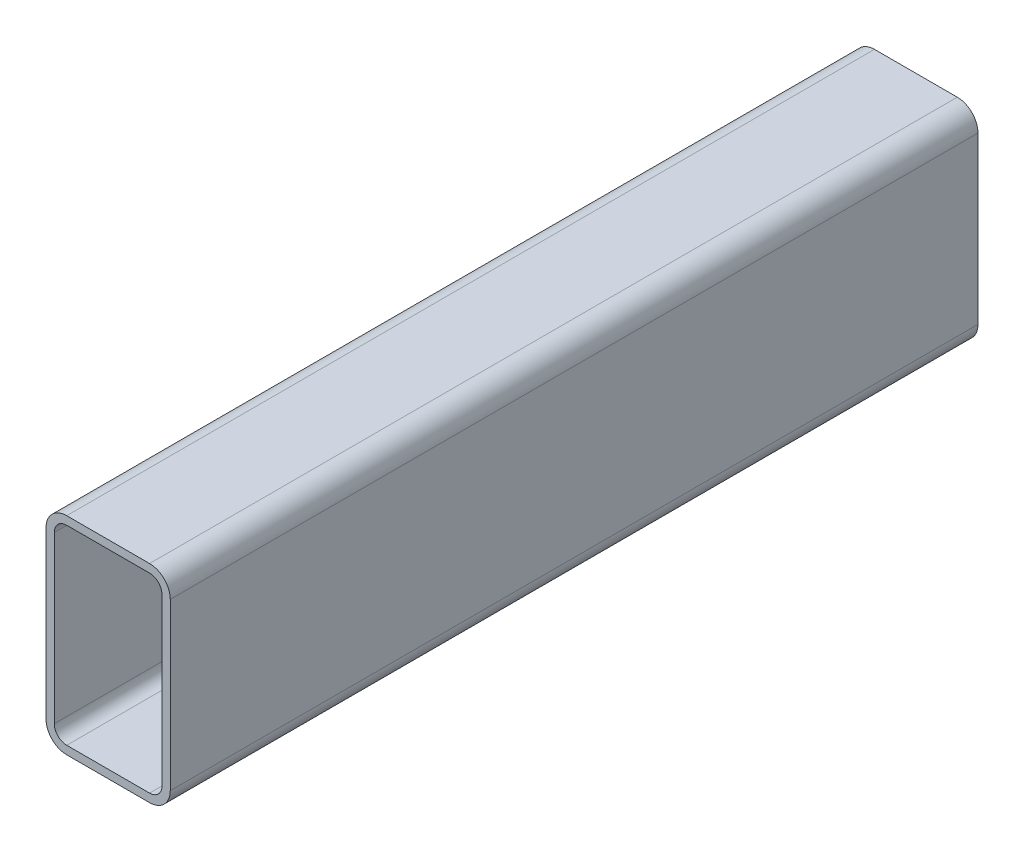
ISO-10303-21;
HEADER;
FILE_DESCRIPTION(('STEP AP214'),'2;1');
FILE_NAME('part.step','',(''),(''),'','','');
FILE_SCHEMA(('AUTOMOTIVE_DESIGN { 1 0 10303 214 1 1 1 1 }'));
ENDSEC;
DATA;
#1=APPLICATION_CONTEXT('core data for automotive mechanical design processes');
#2=APPLICATION_PROTOCOL_DEFINITION('international standard','automotive_design',2000,#1);
#3=PRODUCT_CONTEXT('',#1,'mechanical');
#4=PRODUCT('Part','Part','',(#3));
#5=PRODUCT_RELATED_PRODUCT_CATEGORY('part','',(#4));
#6=PRODUCT_DEFINITION_FORMATION('','',#4);
#7=PRODUCT_DEFINITION_CONTEXT('part definition',#1,'design');
#8=PRODUCT_DEFINITION('design','',#6,#7);
#9=PRODUCT_DEFINITION_SHAPE('','',#8);
#10=(LENGTH_UNIT() NAMED_UNIT(*) SI_UNIT(.MILLI.,.METRE.));
#11=(NAMED_UNIT(*) PLANE_ANGLE_UNIT() SI_UNIT($,.RADIAN.));
#12=(NAMED_UNIT(*) SI_UNIT($,.STERADIAN.) SOLID_ANGLE_UNIT());
#13=UNCERTAINTY_MEASURE_WITH_UNIT(LENGTH_MEASURE(1.E-05),#10,'distance_accuracy_value','');
#14=(GEOMETRIC_REPRESENTATION_CONTEXT(3) GLOBAL_UNCERTAINTY_ASSIGNED_CONTEXT((#13)) GLOBAL_UNIT_ASSIGNED_CONTEXT((#10,
#11,#12)) REPRESENTATION_CONTEXT('',''));
#15=CARTESIAN_POINT('',(0.,0.,0.));
#16=DIRECTION('',(0.,0.,1.));
#17=DIRECTION('',(1.,0.,0.));
#18=AXIS2_PLACEMENT_3D('',#15,#16,#17);
#19=CARTESIAN_POINT('',(-25.,50.,243.75));
#20=DIRECTION('',(0.,0.,-1.));
#21=DIRECTION('',(-1.,0.,0.));
#22=AXIS2_PLACEMENT_3D('',#19,#20,#21);
#23=PLANE('',#22);
#24=DIRECTION('',(0.,-1.,0.));
#25=VECTOR('',#24,1.);
#26=CARTESIAN_POINT('',(-37.5,0.,243.75));
#27=LINE('',#26,#25);
#28=CARTESIAN_POINT('',(-37.5,49.9999999999999,243.75));
#29=VERTEX_POINT('',#28);
#30=CARTESIAN_POINT('',(-37.5,-49.9999999999999,243.75));
#31=VERTEX_POINT('',#30);
#32=EDGE_CURVE('E212',#29,#31,#27,.T.);
#33=ORIENTED_EDGE('',*,*,#32,.T.);
#34=CARTESIAN_POINT('',(-25.,-50.,243.75));
#35=DIRECTION('',(0.,0.,1.));
#36=DIRECTION('',(1.,0.,0.));
#37=AXIS2_PLACEMENT_3D('',#34,#35,#36);
#38=CIRCLE('',#37,12.5);
#39=CARTESIAN_POINT('',(-24.9999999999999,-62.5,243.75));
#40=VERTEX_POINT('',#39);
#41=EDGE_CURVE('E214',#31,#40,#38,.T.);
#42=ORIENTED_EDGE('',*,*,#41,.T.);
#43=DIRECTION('',(1.,0.,0.));
#44=VECTOR('',#43,1.);
#45=CARTESIAN_POINT('',(-24.9999999999999,-62.5,243.75));
#46=LINE('',#45,#44);
#47=CARTESIAN_POINT('',(24.9999999999999,-62.5,243.75));
#48=VERTEX_POINT('',#47);
#49=EDGE_CURVE('E217',#40,#48,#46,.T.);
#50=ORIENTED_EDGE('',*,*,#49,.T.);
#51=CARTESIAN_POINT('',(25.,-50.,243.75));
#52=DIRECTION('',(0.,0.,1.));
#53=DIRECTION('',(-1.,0.,0.));
#54=AXIS2_PLACEMENT_3D('',#51,#52,#53);
#55=CIRCLE('',#54,12.5);
#56=CARTESIAN_POINT('',(37.5,-49.9999999999999,243.75));
#57=VERTEX_POINT('',#56);
#58=EDGE_CURVE('E219',#48,#57,#55,.T.);
#59=ORIENTED_EDGE('',*,*,#58,.T.);
#60=DIRECTION('',(0.,1.,0.));
#61=VECTOR('',#60,1.);
#62=CARTESIAN_POINT('',(37.5,0.,243.75));
#63=LINE('',#62,#61);
#64=CARTESIAN_POINT('',(37.5,49.9999999999999,243.75));
#65=VERTEX_POINT('',#64);
#66=EDGE_CURVE('E221',#57,#65,#63,.T.);
#67=ORIENTED_EDGE('',*,*,#66,.T.);
#68=CARTESIAN_POINT('',(25.,50.,243.75));
#69=DIRECTION('',(0.,0.,1.));
#70=DIRECTION('',(1.,0.,0.));
#71=AXIS2_PLACEMENT_3D('',#68,#69,#70);
#72=CIRCLE('',#71,12.5);
#73=CARTESIAN_POINT('',(24.9999999999999,62.5,243.75));
#74=VERTEX_POINT('',#73);
#75=EDGE_CURVE('E223',#65,#74,#72,.T.);
#76=ORIENTED_EDGE('',*,*,#75,.T.);
#77=DIRECTION('',(-1.,0.,0.));
#78=VECTOR('',#77,1.);
#79=CARTESIAN_POINT('',(-24.9999999999999,62.5,243.75));
#80=LINE('',#79,#78);
#81=CARTESIAN_POINT('',(-24.9999999999999,62.5,243.75));
#82=VERTEX_POINT('',#81);
#83=EDGE_CURVE('E225',#74,#82,#80,.T.);
#84=ORIENTED_EDGE('',*,*,#83,.T.);
#85=CARTESIAN_POINT('',(-25.,50.,243.75));
#86=DIRECTION('',(0.,0.,1.));
#87=DIRECTION('',(-1.,0.,0.));
#88=AXIS2_PLACEMENT_3D('',#85,#86,#87);
#89=CIRCLE('',#88,12.5);
#90=EDGE_CURVE('E227',#82,#29,#89,.T.);
#91=ORIENTED_EDGE('',*,*,#90,.T.);
#92=EDGE_LOOP('',(#33,#42,#50,#59,#67,#76,#84,#91));
#93=FACE_BOUND('',#92,.T.);
#94=CARTESIAN_POINT('',(25.,50.,243.75));
#95=DIRECTION('',(0.,0.,1.));
#96=DIRECTION('',(1.,0.,0.));
#97=AXIS2_PLACEMENT_3D('',#94,#95,#96);
#98=CIRCLE('',#97,7.49999999999999);
#99=CARTESIAN_POINT('',(32.5,49.9999999999999,243.75));
#100=VERTEX_POINT('',#99);
#101=CARTESIAN_POINT('',(25.,57.5,243.75));
#102=VERTEX_POINT('',#101);
#103=EDGE_CURVE('E150',#100,#102,#98,.T.);
#104=ORIENTED_EDGE('',*,*,#103,.F.);
#105=DIRECTION('',(0.,1.,0.));
#106=VECTOR('',#105,1.);
#107=CARTESIAN_POINT('',(32.5,0.,243.75));
#108=LINE('',#107,#106);
#109=CARTESIAN_POINT('',(32.5,-49.9999999999999,243.75));
#110=VERTEX_POINT('',#109);
#111=EDGE_CURVE('E145',#110,#100,#108,.T.);
#112=ORIENTED_EDGE('',*,*,#111,.F.);
#113=CARTESIAN_POINT('',(25.,-50.,243.75));
#114=DIRECTION('',(0.,0.,1.));
#115=DIRECTION('',(-1.,0.,0.));
#116=AXIS2_PLACEMENT_3D('',#113,#114,#115);
#117=CIRCLE('',#116,7.49999999999999);
#118=CARTESIAN_POINT('',(25.,-57.5,243.75));
#119=VERTEX_POINT('',#118);
#120=EDGE_CURVE('E176',#119,#110,#117,.T.);
#121=ORIENTED_EDGE('',*,*,#120,.F.);
#122=DIRECTION('',(1.,0.,0.));
#123=VECTOR('',#122,1.);
#124=CARTESIAN_POINT('',(-25.,-57.5,243.75));
#125=LINE('',#124,#123);
#126=CARTESIAN_POINT('',(-25.,-57.5,243.75));
#127=VERTEX_POINT('',#126);
#128=EDGE_CURVE('E174',#127,#119,#125,.T.);
#129=ORIENTED_EDGE('',*,*,#128,.F.);
#130=CARTESIAN_POINT('',(-25.,-50.,243.75));
#131=DIRECTION('',(0.,0.,1.));
#132=DIRECTION('',(1.,0.,0.));
#133=AXIS2_PLACEMENT_3D('',#130,#131,#132);
#134=CIRCLE('',#133,7.49999999999999);
#135=CARTESIAN_POINT('',(-32.5,-49.9999999999999,243.75));
#136=VERTEX_POINT('',#135);
#137=EDGE_CURVE('E172',#136,#127,#134,.T.);
#138=ORIENTED_EDGE('',*,*,#137,.F.);
#139=DIRECTION('',(0.,-1.,0.));
#140=VECTOR('',#139,1.);
#141=CARTESIAN_POINT('',(-32.5,0.,243.75));
#142=LINE('',#141,#140);
#143=CARTESIAN_POINT('',(-32.5,49.9999999999999,243.75));
#144=VERTEX_POINT('',#143);
#145=EDGE_CURVE('E170',#144,#136,#142,.T.);
#146=ORIENTED_EDGE('',*,*,#145,.F.);
#147=CARTESIAN_POINT('',(-25.,50.,243.75));
#148=DIRECTION('',(0.,0.,1.));
#149=DIRECTION('',(-1.,0.,0.));
#150=AXIS2_PLACEMENT_3D('',#147,#148,#149);
#151=CIRCLE('',#150,7.49999999999999);
#152=CARTESIAN_POINT('',(-25.,57.5,243.75));
#153=VERTEX_POINT('',#152);
#154=EDGE_CURVE('E166',#153,#144,#151,.T.);
#155=ORIENTED_EDGE('',*,*,#154,.F.);
#156=DIRECTION('',(-1.,0.,0.));
#157=VECTOR('',#156,1.);
#158=CARTESIAN_POINT('',(-25.,57.5,243.75));
#159=LINE('',#158,#157);
#160=EDGE_CURVE('E164',#102,#153,#159,.T.);
#161=ORIENTED_EDGE('',*,*,#160,.F.);
#162=EDGE_LOOP('',(#104,#112,#121,#129,#138,#146,#155,#161));
#163=FACE_BOUND('',#162,.T.);
#164=ADVANCED_FACE('F35',(#93,#163),#23,.F.);
#165=CARTESIAN_POINT('',(-25.,50.,-243.75));
#166=DIRECTION('',(0.,0.,-1.));
#167=DIRECTION('',(-1.,0.,0.));
#168=AXIS2_PLACEMENT_3D('',#165,#166,#167);
#169=PLANE('',#168);
#170=DIRECTION('',(0.,-1.,0.));
#171=VECTOR('',#170,1.);
#172=CARTESIAN_POINT('',(-37.5,0.,-243.75));
#173=LINE('',#172,#171);
#174=CARTESIAN_POINT('',(-37.5,49.9999999999999,-243.75));
#175=VERTEX_POINT('',#174);
#176=CARTESIAN_POINT('',(-37.5,-49.9999999999999,-243.75));
#177=VERTEX_POINT('',#176);
#178=EDGE_CURVE('E159',#175,#177,#173,.T.);
#179=ORIENTED_EDGE('',*,*,#178,.F.);
#180=CARTESIAN_POINT('',(-25.,50.,-243.75));
#181=DIRECTION('',(0.,0.,1.));
#182=DIRECTION('',(-1.,0.,0.));
#183=AXIS2_PLACEMENT_3D('',#180,#181,#182);
#184=CIRCLE('',#183,12.5);
#185=CARTESIAN_POINT('',(-24.9999999999999,62.5,-243.75));
#186=VERTEX_POINT('',#185);
#187=EDGE_CURVE('E215',#186,#175,#184,.T.);
#188=ORIENTED_EDGE('',*,*,#187,.F.);
#189=DIRECTION('',(-1.,0.,0.));
#190=VECTOR('',#189,1.);
#191=CARTESIAN_POINT('',(-24.9999999999999,62.5,-243.75));
#192=LINE('',#191,#190);
#193=CARTESIAN_POINT('',(24.9999999999999,62.5,-243.75));
#194=VERTEX_POINT('',#193);
#195=EDGE_CURVE('E243',#194,#186,#192,.T.);
#196=ORIENTED_EDGE('',*,*,#195,.F.);
#197=CARTESIAN_POINT('',(25.,50.,-243.75));
#198=DIRECTION('',(0.,0.,1.));
#199=DIRECTION('',(1.,0.,0.));
#200=AXIS2_PLACEMENT_3D('',#197,#198,#199);
#201=CIRCLE('',#200,12.5);
#202=CARTESIAN_POINT('',(37.5,49.9999999999999,-243.75));
#203=VERTEX_POINT('',#202);
#204=EDGE_CURVE('E241',#203,#194,#201,.T.);
#205=ORIENTED_EDGE('',*,*,#204,.F.);
#206=DIRECTION('',(0.,1.,0.));
#207=VECTOR('',#206,1.);
#208=CARTESIAN_POINT('',(37.5,0.,-243.75));
#209=LINE('',#208,#207);
#210=CARTESIAN_POINT('',(37.5,-49.9999999999999,-243.75));
#211=VERTEX_POINT('',#210);
#212=EDGE_CURVE('E239',#211,#203,#209,.T.);
#213=ORIENTED_EDGE('',*,*,#212,.F.);
#214=CARTESIAN_POINT('',(25.,-50.,-243.75));
#215=DIRECTION('',(0.,0.,1.));
#216=DIRECTION('',(-1.,0.,0.));
#217=AXIS2_PLACEMENT_3D('',#214,#215,#216);
#218=CIRCLE('',#217,12.5);
#219=CARTESIAN_POINT('',(24.9999999999999,-62.5,-243.75));
#220=VERTEX_POINT('',#219);
#221=EDGE_CURVE('E236',#220,#211,#218,.T.);
#222=ORIENTED_EDGE('',*,*,#221,.F.);
#223=DIRECTION('',(1.,0.,0.));
#224=VECTOR('',#223,1.);
#225=CARTESIAN_POINT('',(24.9999999999999,-62.5,-243.75));
#226=LINE('',#225,#224);
#227=CARTESIAN_POINT('',(-24.9999999999999,-62.5,-243.75));
#228=VERTEX_POINT('',#227);
#229=EDGE_CURVE('E234',#228,#220,#226,.T.);
#230=ORIENTED_EDGE('',*,*,#229,.F.);
#231=CARTESIAN_POINT('',(-25.,-50.,-243.75));
#232=DIRECTION('',(0.,0.,1.));
#233=DIRECTION('',(1.,0.,0.));
#234=AXIS2_PLACEMENT_3D('',#231,#232,#233);
#235=CIRCLE('',#234,12.5);
#236=EDGE_CURVE('E231',#177,#228,#235,.T.);
#237=ORIENTED_EDGE('',*,*,#236,.F.);
#238=EDGE_LOOP('',(#179,#188,#196,#205,#213,#222,#230,#237));
#239=FACE_BOUND('',#238,.T.);
#240=DIRECTION('',(0.,1.,0.));
#241=VECTOR('',#240,1.);
#242=CARTESIAN_POINT('',(32.5,0.,-243.75));
#243=LINE('',#242,#241);
#244=CARTESIAN_POINT('',(32.5,-49.9999999999999,-243.75));
#245=VERTEX_POINT('',#244);
#246=CARTESIAN_POINT('',(32.5,49.9999999999999,-243.75));
#247=VERTEX_POINT('',#246);
#248=EDGE_CURVE('E151',#245,#247,#243,.T.);
#249=ORIENTED_EDGE('',*,*,#248,.T.);
#250=CARTESIAN_POINT('',(25.,50.,-243.75));
#251=DIRECTION('',(0.,0.,1.));
#252=DIRECTION('',(1.,0.,0.));
#253=AXIS2_PLACEMENT_3D('',#250,#251,#252);
#254=CIRCLE('',#253,7.49999999999999);
#255=CARTESIAN_POINT('',(25.,57.5,-243.75));
#256=VERTEX_POINT('',#255);
#257=EDGE_CURVE('E157',#247,#256,#254,.T.);
#258=ORIENTED_EDGE('',*,*,#257,.T.);
#259=DIRECTION('',(-1.,0.,0.));
#260=VECTOR('',#259,1.);
#261=CARTESIAN_POINT('',(-25.,57.5,-243.75));
#262=LINE('',#261,#260);
#263=CARTESIAN_POINT('',(-25.,57.5,-243.75));
#264=VERTEX_POINT('',#263);
#265=EDGE_CURVE('E179',#256,#264,#262,.T.);
#266=ORIENTED_EDGE('',*,*,#265,.T.);
#267=CARTESIAN_POINT('',(-25.,50.,-243.75));
#268=DIRECTION('',(0.,0.,1.));
#269=DIRECTION('',(-1.,0.,0.));
#270=AXIS2_PLACEMENT_3D('',#267,#268,#269);
#271=CIRCLE('',#270,7.49999999999999);
#272=CARTESIAN_POINT('',(-32.5,49.9999999999999,-243.75));
#273=VERTEX_POINT('',#272);
#274=EDGE_CURVE('E182',#264,#273,#271,.T.);
#275=ORIENTED_EDGE('',*,*,#274,.T.);
#276=DIRECTION('',(0.,-1.,0.));
#277=VECTOR('',#276,1.);
#278=CARTESIAN_POINT('',(-32.5,0.,-243.75));
#279=LINE('',#278,#277);
#280=CARTESIAN_POINT('',(-32.5,-49.9999999999999,-243.75));
#281=VERTEX_POINT('',#280);
#282=EDGE_CURVE('E185',#273,#281,#279,.T.);
#283=ORIENTED_EDGE('',*,*,#282,.T.);
#284=CARTESIAN_POINT('',(-25.,-50.,-243.75));
#285=DIRECTION('',(0.,0.,1.));
#286=DIRECTION('',(1.,0.,0.));
#287=AXIS2_PLACEMENT_3D('',#284,#285,#286);
#288=CIRCLE('',#287,7.49999999999999);
#289=CARTESIAN_POINT('',(-25.,-57.5,-243.75));
#290=VERTEX_POINT('',#289);
#291=EDGE_CURVE('E188',#281,#290,#288,.T.);
#292=ORIENTED_EDGE('',*,*,#291,.T.);
#293=DIRECTION('',(1.,0.,0.));
#294=VECTOR('',#293,1.);
#295=CARTESIAN_POINT('',(25.,-57.5,-243.75));
#296=LINE('',#295,#294);
#297=CARTESIAN_POINT('',(25.,-57.5,-243.75));
#298=VERTEX_POINT('',#297);
#299=EDGE_CURVE('E191',#290,#298,#296,.T.);
#300=ORIENTED_EDGE('',*,*,#299,.T.);
#301=CARTESIAN_POINT('',(25.,-50.,-243.75));
#302=DIRECTION('',(0.,0.,1.));
#303=DIRECTION('',(-1.,0.,0.));
#304=AXIS2_PLACEMENT_3D('',#301,#302,#303);
#305=CIRCLE('',#304,7.49999999999999);
#306=EDGE_CURVE('E194',#298,#245,#305,.T.);
#307=ORIENTED_EDGE('',*,*,#306,.T.);
#308=EDGE_LOOP('',(#249,#258,#266,#275,#283,#292,#300,#307));
#309=FACE_BOUND('',#308,.T.);
#310=ADVANCED_FACE('F275',(#239,#309),#169,.T.);
#311=CARTESIAN_POINT('',(-37.5,0.,243.75));
#312=DIRECTION('',(1.,0.,0.));
#313=DIRECTION('',(0.,1.,0.));
#314=AXIS2_PLACEMENT_3D('',#311,#312,#313);
#315=PLANE('',#314);
#316=ORIENTED_EDGE('',*,*,#178,.T.);
#317=DIRECTION('',(0.,0.,-1.));
#318=VECTOR('',#317,1.);
#319=CARTESIAN_POINT('',(-37.5,-49.9999999999999,243.75));
#320=LINE('',#319,#318);
#321=EDGE_CURVE('E11',#31,#177,#320,.T.);
#322=ORIENTED_EDGE('',*,*,#321,.F.);
#323=ORIENTED_EDGE('',*,*,#32,.F.);
#324=DIRECTION('',(0.,0.,-1.));
#325=VECTOR('',#324,1.);
#326=CARTESIAN_POINT('',(-37.5,49.9999999999999,243.75));
#327=LINE('',#326,#325);
#328=EDGE_CURVE('E229',#29,#175,#327,.T.);
#329=ORIENTED_EDGE('',*,*,#328,.T.);
#330=EDGE_LOOP('',(#316,#322,#323,#329));
#331=FACE_BOUND('',#330,.T.);
#332=ADVANCED_FACE('F37',(#331),#315,.F.);
#333=CARTESIAN_POINT('',(-25.,-50.,243.75));
#334=DIRECTION('',(0.,0.,-1.));
#335=DIRECTION('',(-1.,0.,0.));
#336=AXIS2_PLACEMENT_3D('',#333,#334,#335);
#337=CYLINDRICAL_SURFACE('',#336,12.5);
#338=ORIENTED_EDGE('',*,*,#236,.T.);
#339=DIRECTION('',(0.,0.,-1.));
#340=VECTOR('',#339,1.);
#341=CARTESIAN_POINT('',(-24.9999999999999,-62.5,243.75));
#342=LINE('',#341,#340);
#343=EDGE_CURVE('E43',#40,#228,#342,.T.);
#344=ORIENTED_EDGE('',*,*,#343,.F.);
#345=ORIENTED_EDGE('',*,*,#41,.F.);
#346=ORIENTED_EDGE('',*,*,#321,.T.);
#347=EDGE_LOOP('',(#338,#344,#345,#346));
#348=FACE_BOUND('',#347,.T.);
#349=ADVANCED_FACE('F271',(#348),#337,.T.);
#350=CARTESIAN_POINT('',(24.9999999999999,-62.5,243.75));
#351=DIRECTION('',(0.,1.,0.));
#352=DIRECTION('',(-1.,0.,0.));
#353=AXIS2_PLACEMENT_3D('',#350,#351,#352);
#354=PLANE('',#353);
#355=ORIENTED_EDGE('',*,*,#229,.T.);
#356=DIRECTION('',(0.,0.,-1.));
#357=VECTOR('',#356,1.);
#358=CARTESIAN_POINT('',(24.9999999999999,-62.5,243.75));
#359=LINE('',#358,#357);
#360=EDGE_CURVE('E261',#48,#220,#359,.T.);
#361=ORIENTED_EDGE('',*,*,#360,.F.);
#362=ORIENTED_EDGE('',*,*,#49,.F.);
#363=ORIENTED_EDGE('',*,*,#343,.T.);
#364=EDGE_LOOP('',(#355,#361,#362,#363));
#365=FACE_BOUND('',#364,.T.);
#366=ADVANCED_FACE('F267',(#365),#354,.F.);
#367=CARTESIAN_POINT('',(25.,-50.,243.75));
#368=DIRECTION('',(0.,0.,-1.));
#369=DIRECTION('',(-1.,0.,0.));
#370=AXIS2_PLACEMENT_3D('',#367,#368,#369);
#371=CYLINDRICAL_SURFACE('',#370,12.5);
#372=ORIENTED_EDGE('',*,*,#221,.T.);
#373=DIRECTION('',(0.,0.,-1.));
#374=VECTOR('',#373,1.);
#375=CARTESIAN_POINT('',(37.5,-49.9999999999999,243.75));
#376=LINE('',#375,#374);
#377=EDGE_CURVE('E258',#57,#211,#376,.T.);
#378=ORIENTED_EDGE('',*,*,#377,.F.);
#379=ORIENTED_EDGE('',*,*,#58,.F.);
#380=ORIENTED_EDGE('',*,*,#360,.T.);
#381=EDGE_LOOP('',(#372,#378,#379,#380));
#382=FACE_BOUND('',#381,.T.);
#383=ADVANCED_FACE('F282',(#382),#371,.T.);
#384=CARTESIAN_POINT('',(37.5,0.,243.75));
#385=DIRECTION('',(-1.,0.,0.));
#386=DIRECTION('',(0.,-1.,0.));
#387=AXIS2_PLACEMENT_3D('',#384,#385,#386);
#388=PLANE('',#387);
#389=ORIENTED_EDGE('',*,*,#212,.T.);
#390=DIRECTION('',(0.,0.,-1.));
#391=VECTOR('',#390,1.);
#392=CARTESIAN_POINT('',(37.5,49.9999999999999,243.75));
#393=LINE('',#392,#391);
#394=EDGE_CURVE('E255',#65,#203,#393,.T.);
#395=ORIENTED_EDGE('',*,*,#394,.F.);
#396=ORIENTED_EDGE('',*,*,#66,.F.);
#397=ORIENTED_EDGE('',*,*,#377,.T.);
#398=EDGE_LOOP('',(#389,#395,#396,#397));
#399=FACE_BOUND('',#398,.T.);
#400=ADVANCED_FACE('F286',(#399),#388,.F.);
#401=CARTESIAN_POINT('',(25.,50.,243.75));
#402=DIRECTION('',(0.,0.,-1.));
#403=DIRECTION('',(-1.,0.,0.));
#404=AXIS2_PLACEMENT_3D('',#401,#402,#403);
#405=CYLINDRICAL_SURFACE('',#404,12.5);
#406=ORIENTED_EDGE('',*,*,#204,.T.);
#407=DIRECTION('',(0.,0.,-1.));
#408=VECTOR('',#407,1.);
#409=CARTESIAN_POINT('',(24.9999999999999,62.5,243.75));
#410=LINE('',#409,#408);
#411=EDGE_CURVE('E252',#74,#194,#410,.T.);
#412=ORIENTED_EDGE('',*,*,#411,.F.);
#413=ORIENTED_EDGE('',*,*,#75,.F.);
#414=ORIENTED_EDGE('',*,*,#394,.T.);
#415=EDGE_LOOP('',(#406,#412,#413,#414));
#416=FACE_BOUND('',#415,.T.);
#417=ADVANCED_FACE('F303',(#416),#405,.T.);
#418=CARTESIAN_POINT('',(-24.9999999999999,62.5,243.75));
#419=DIRECTION('',(0.,-1.,0.));
#420=DIRECTION('',(0.,0.,-1.));
#421=AXIS2_PLACEMENT_3D('',#418,#419,#420);
#422=PLANE('',#421);
#423=ORIENTED_EDGE('',*,*,#195,.T.);
#424=DIRECTION('',(0.,0.,-1.));
#425=VECTOR('',#424,1.);
#426=CARTESIAN_POINT('',(-24.9999999999999,62.5,243.75));
#427=LINE('',#426,#425);
#428=EDGE_CURVE('E249',#82,#186,#427,.T.);
#429=ORIENTED_EDGE('',*,*,#428,.F.);
#430=ORIENTED_EDGE('',*,*,#83,.F.);
#431=ORIENTED_EDGE('',*,*,#411,.T.);
#432=EDGE_LOOP('',(#423,#429,#430,#431));
#433=FACE_BOUND('',#432,.T.);
#434=ADVANCED_FACE('F300',(#433),#422,.F.);
#435=CARTESIAN_POINT('',(-25.,50.,243.75));
#436=DIRECTION('',(0.,0.,-1.));
#437=DIRECTION('',(-1.,0.,0.));
#438=AXIS2_PLACEMENT_3D('',#435,#436,#437);
#439=CYLINDRICAL_SURFACE('',#438,12.5);
#440=ORIENTED_EDGE('',*,*,#187,.T.);
#441=ORIENTED_EDGE('',*,*,#328,.F.);
#442=ORIENTED_EDGE('',*,*,#90,.F.);
#443=ORIENTED_EDGE('',*,*,#428,.T.);
#444=EDGE_LOOP('',(#440,#441,#442,#443));
#445=FACE_BOUND('',#444,.T.);
#446=ADVANCED_FACE('F296',(#445),#439,.T.);
#447=CARTESIAN_POINT('',(25.,50.,243.75));
#448=DIRECTION('',(0.,0.,-1.));
#449=DIRECTION('',(-1.,0.,0.));
#450=AXIS2_PLACEMENT_3D('',#447,#448,#449);
#451=CYLINDRICAL_SURFACE('',#450,7.49999999999999);
#452=ORIENTED_EDGE('',*,*,#257,.F.);
#453=DIRECTION('',(0.,0.,-1.));
#454=VECTOR('',#453,1.);
#455=CARTESIAN_POINT('',(32.5,49.9999999999999,243.75));
#456=LINE('',#455,#454);
#457=EDGE_CURVE('E55',#100,#247,#456,.T.);
#458=ORIENTED_EDGE('',*,*,#457,.F.);
#459=ORIENTED_EDGE('',*,*,#103,.T.);
#460=DIRECTION('',(0.,0.,-1.));
#461=VECTOR('',#460,1.);
#462=CARTESIAN_POINT('',(25.,57.5,243.75));
#463=LINE('',#462,#461);
#464=EDGE_CURVE('E160',#102,#256,#463,.T.);
#465=ORIENTED_EDGE('',*,*,#464,.T.);
#466=EDGE_LOOP('',(#452,#458,#459,#465));
#467=FACE_BOUND('',#466,.T.);
#468=ADVANCED_FACE('F154',(#467),#451,.F.);
#469=CARTESIAN_POINT('',(-25.,57.5,243.75));
#470=DIRECTION('',(0.,-1.,0.));
#471=DIRECTION('',(0.,0.,-1.));
#472=AXIS2_PLACEMENT_3D('',#469,#470,#471);
#473=PLANE('',#472);
#474=ORIENTED_EDGE('',*,*,#265,.F.);
#475=ORIENTED_EDGE('',*,*,#464,.F.);
#476=ORIENTED_EDGE('',*,*,#160,.T.);
#477=DIRECTION('',(0.,0.,-1.));
#478=VECTOR('',#477,1.);
#479=CARTESIAN_POINT('',(-25.,57.5,243.75));
#480=LINE('',#479,#478);
#481=EDGE_CURVE('E209',#153,#264,#480,.T.);
#482=ORIENTED_EDGE('',*,*,#481,.T.);
#483=EDGE_LOOP('',(#474,#475,#476,#482));
#484=FACE_BOUND('',#483,.T.);
#485=ADVANCED_FACE('F325',(#484),#473,.T.);
#486=CARTESIAN_POINT('',(-25.,50.,243.75));
#487=DIRECTION('',(0.,0.,-1.));
#488=DIRECTION('',(-1.,0.,0.));
#489=AXIS2_PLACEMENT_3D('',#486,#487,#488);
#490=CYLINDRICAL_SURFACE('',#489,7.49999999999999);
#491=ORIENTED_EDGE('',*,*,#274,.F.);
#492=ORIENTED_EDGE('',*,*,#481,.F.);
#493=ORIENTED_EDGE('',*,*,#154,.T.);
#494=DIRECTION('',(0.,0.,-1.));
#495=VECTOR('',#494,1.);
#496=CARTESIAN_POINT('',(-32.5,49.9999999999999,243.75));
#497=LINE('',#496,#495);
#498=EDGE_CURVE('E206',#144,#273,#497,.T.);
#499=ORIENTED_EDGE('',*,*,#498,.T.);
#500=EDGE_LOOP('',(#491,#492,#493,#499));
#501=FACE_BOUND('',#500,.T.);
#502=ADVANCED_FACE('F329',(#501),#490,.F.);
#503=CARTESIAN_POINT('',(-32.5,0.,243.75));
#504=DIRECTION('',(1.,0.,0.));
#505=DIRECTION('',(0.,0.,-1.));
#506=AXIS2_PLACEMENT_3D('',#503,#504,#505);
#507=PLANE('',#506);
#508=ORIENTED_EDGE('',*,*,#282,.F.);
#509=ORIENTED_EDGE('',*,*,#498,.F.);
#510=ORIENTED_EDGE('',*,*,#145,.T.);
#511=DIRECTION('',(0.,0.,-1.));
#512=VECTOR('',#511,1.);
#513=CARTESIAN_POINT('',(-32.5,-49.9999999999999,243.75));
#514=LINE('',#513,#512);
#515=EDGE_CURVE('E204',#136,#281,#514,.T.);
#516=ORIENTED_EDGE('',*,*,#515,.T.);
#517=EDGE_LOOP('',(#508,#509,#510,#516));
#518=FACE_BOUND('',#517,.T.);
#519=ADVANCED_FACE('F334',(#518),#507,.T.);
#520=CARTESIAN_POINT('',(-25.,-50.,243.75));
#521=DIRECTION('',(0.,0.,-1.));
#522=DIRECTION('',(-1.,0.,0.));
#523=AXIS2_PLACEMENT_3D('',#520,#521,#522);
#524=CYLINDRICAL_SURFACE('',#523,7.49999999999999);
#525=ORIENTED_EDGE('',*,*,#291,.F.);
#526=ORIENTED_EDGE('',*,*,#515,.F.);
#527=ORIENTED_EDGE('',*,*,#137,.T.);
#528=DIRECTION('',(0.,0.,-1.));
#529=VECTOR('',#528,1.);
#530=CARTESIAN_POINT('',(-25.,-57.5,243.75));
#531=LINE('',#530,#529);
#532=EDGE_CURVE('E201',#127,#290,#531,.T.);
#533=ORIENTED_EDGE('',*,*,#532,.T.);
#534=EDGE_LOOP('',(#525,#526,#527,#533));
#535=FACE_BOUND('',#534,.T.);
#536=ADVANCED_FACE('F341',(#535),#524,.F.);
#537=CARTESIAN_POINT('',(25.,-57.5,243.75));
#538=DIRECTION('',(0.,1.,0.));
#539=DIRECTION('',(0.,0.,1.));
#540=AXIS2_PLACEMENT_3D('',#537,#538,#539);
#541=PLANE('',#540);
#542=ORIENTED_EDGE('',*,*,#299,.F.);
#543=ORIENTED_EDGE('',*,*,#532,.F.);
#544=ORIENTED_EDGE('',*,*,#128,.T.);
#545=DIRECTION('',(0.,0.,-1.));
#546=VECTOR('',#545,1.);
#547=CARTESIAN_POINT('',(25.,-57.5,243.75));
#548=LINE('',#547,#546);
#549=EDGE_CURVE('E199',#119,#298,#548,.T.);
#550=ORIENTED_EDGE('',*,*,#549,.T.);
#551=EDGE_LOOP('',(#542,#543,#544,#550));
#552=FACE_BOUND('',#551,.T.);
#553=ADVANCED_FACE('F345',(#552),#541,.T.);
#554=CARTESIAN_POINT('',(25.,-50.,243.75));
#555=DIRECTION('',(0.,0.,-1.));
#556=DIRECTION('',(-1.,0.,0.));
#557=AXIS2_PLACEMENT_3D('',#554,#555,#556);
#558=CYLINDRICAL_SURFACE('',#557,7.49999999999999);
#559=ORIENTED_EDGE('',*,*,#306,.F.);
#560=ORIENTED_EDGE('',*,*,#549,.F.);
#561=ORIENTED_EDGE('',*,*,#120,.T.);
#562=DIRECTION('',(0.,0.,-1.));
#563=VECTOR('',#562,1.);
#564=CARTESIAN_POINT('',(32.5,-49.9999999999999,243.75));
#565=LINE('',#564,#563);
#566=EDGE_CURVE('E50',#110,#245,#565,.T.);
#567=ORIENTED_EDGE('',*,*,#566,.T.);
#568=EDGE_LOOP('',(#559,#560,#561,#567));
#569=FACE_BOUND('',#568,.T.);
#570=ADVANCED_FACE('F349',(#569),#558,.F.);
#571=CARTESIAN_POINT('',(32.5,0.,243.75));
#572=DIRECTION('',(-1.,0.,0.));
#573=DIRECTION('',(0.,0.,1.));
#574=AXIS2_PLACEMENT_3D('',#571,#572,#573);
#575=PLANE('',#574);
#576=ORIENTED_EDGE('',*,*,#248,.F.);
#577=ORIENTED_EDGE('',*,*,#566,.F.);
#578=ORIENTED_EDGE('',*,*,#111,.T.);
#579=ORIENTED_EDGE('',*,*,#457,.T.);
#580=EDGE_LOOP('',(#576,#577,#578,#579));
#581=FACE_BOUND('',#580,.T.);
#582=ADVANCED_FACE('F146',(#581),#575,.T.);
#583=CLOSED_SHELL('',(#164,#310,#332,#349,#366,#383,#400,#417,#434,#446,#468,#485,#502,#519,
#536,#553,#570,#582));
#584=MANIFOLD_SOLID_BREP('B2',#583);
#585=ADVANCED_BREP_SHAPE_REPRESENTATION('',(#18,#584),#14);
#586=SHAPE_DEFINITION_REPRESENTATION(#9,#585);
ENDSEC;
END-ISO-10303-21;
